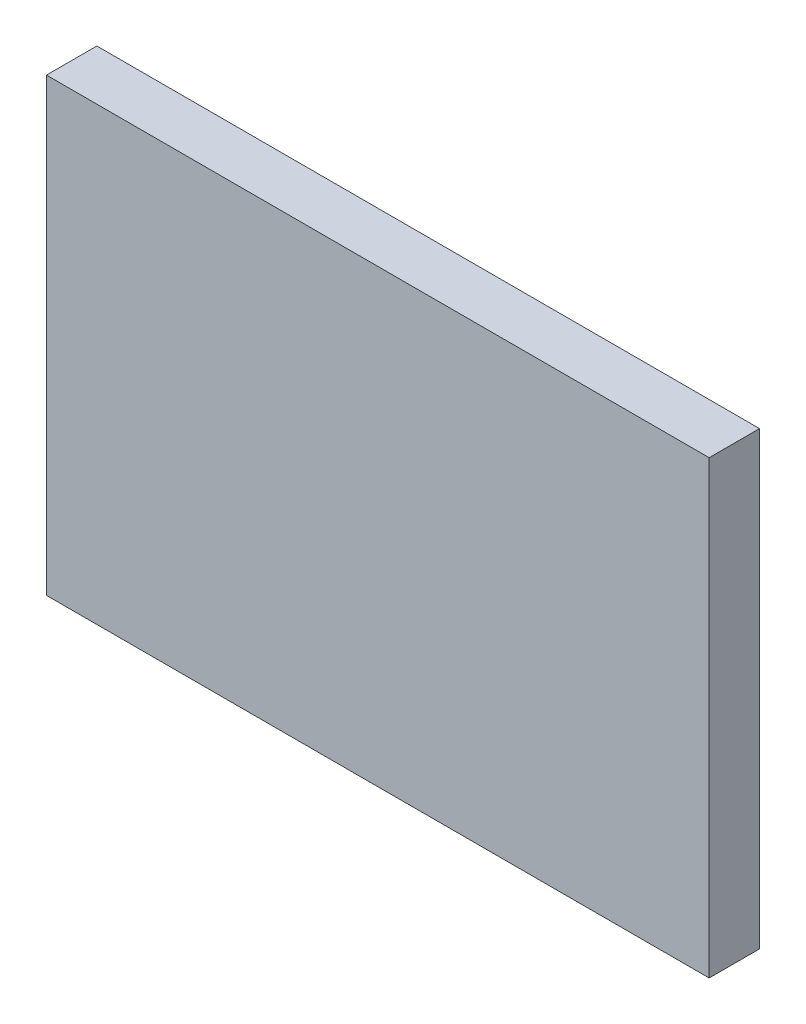
ISO-10303-21;
HEADER;
FILE_DESCRIPTION(('STEP AP214'),'2;1');
FILE_NAME('part.step','',(''),(''),'','','');
FILE_SCHEMA(('AUTOMOTIVE_DESIGN { 1 0 10303 214 1 1 1 1 }'));
ENDSEC;
DATA;
#1=APPLICATION_CONTEXT('core data for automotive mechanical design processes');
#2=APPLICATION_PROTOCOL_DEFINITION('international standard','automotive_design',2000,#1);
#3=PRODUCT_CONTEXT('',#1,'mechanical');
#4=PRODUCT('Part','Part','',(#3));
#5=PRODUCT_RELATED_PRODUCT_CATEGORY('part','',(#4));
#6=PRODUCT_DEFINITION_FORMATION('','',#4);
#7=PRODUCT_DEFINITION_CONTEXT('part definition',#1,'design');
#8=PRODUCT_DEFINITION('design','',#6,#7);
#9=PRODUCT_DEFINITION_SHAPE('','',#8);
#10=(LENGTH_UNIT() NAMED_UNIT(*) SI_UNIT(.MILLI.,.METRE.));
#11=(NAMED_UNIT(*) PLANE_ANGLE_UNIT() SI_UNIT($,.RADIAN.));
#12=(NAMED_UNIT(*) SI_UNIT($,.STERADIAN.) SOLID_ANGLE_UNIT());
#13=UNCERTAINTY_MEASURE_WITH_UNIT(LENGTH_MEASURE(1.E-05),#10,'distance_accuracy_value','');
#14=(GEOMETRIC_REPRESENTATION_CONTEXT(3) GLOBAL_UNCERTAINTY_ASSIGNED_CONTEXT((#13)) GLOBAL_UNIT_ASSIGNED_CONTEXT((#10,
#11,#12)) REPRESENTATION_CONTEXT('',''));
#15=CARTESIAN_POINT('',(0.,0.,0.));
#16=DIRECTION('',(0.,0.,1.));
#17=DIRECTION('',(1.,0.,0.));
#18=AXIS2_PLACEMENT_3D('',#15,#16,#17);
#19=CARTESIAN_POINT('',(0.,0.,3.8));
#20=DIRECTION('',(1.,0.,0.));
#21=DIRECTION('',(0.,1.,0.));
#22=AXIS2_PLACEMENT_3D('',#19,#20,#21);
#23=PLANE('',#22);
#24=DIRECTION('',(0.,-1.,0.));
#25=VECTOR('',#24,1.);
#26=CARTESIAN_POINT('',(0.,0.,0.));
#27=LINE('',#26,#25);
#28=CARTESIAN_POINT('',(0.,0.,0.));
#29=VERTEX_POINT('',#28);
#30=CARTESIAN_POINT('',(0.,-34.,0.));
#31=VERTEX_POINT('',#30);
#32=EDGE_CURVE('E81',#29,#31,#27,.T.);
#33=ORIENTED_EDGE('',*,*,#32,.T.);
#34=DIRECTION('',(0.,0.,-1.));
#35=VECTOR('',#34,1.);
#36=CARTESIAN_POINT('',(0.,-34.,3.8));
#37=LINE('',#36,#35);
#38=CARTESIAN_POINT('',(0.,-34.,3.8));
#39=VERTEX_POINT('',#38);
#40=EDGE_CURVE('E11',#39,#31,#37,.T.);
#41=ORIENTED_EDGE('',*,*,#40,.F.);
#42=DIRECTION('',(0.,-1.,0.));
#43=VECTOR('',#42,1.);
#44=CARTESIAN_POINT('',(0.,0.,3.8));
#45=LINE('',#44,#43);
#46=CARTESIAN_POINT('',(0.,0.,3.8));
#47=VERTEX_POINT('',#46);
#48=EDGE_CURVE('E83',#47,#39,#45,.T.);
#49=ORIENTED_EDGE('',*,*,#48,.F.);
#50=DIRECTION('',(0.,0.,-1.));
#51=VECTOR('',#50,1.);
#52=CARTESIAN_POINT('',(0.,0.,3.8));
#53=LINE('',#52,#51);
#54=EDGE_CURVE('E44',#47,#29,#53,.T.);
#55=ORIENTED_EDGE('',*,*,#54,.T.);
#56=EDGE_LOOP('',(#33,#41,#49,#55));
#57=FACE_BOUND('',#56,.T.);
#58=ADVANCED_FACE('F36',(#57),#23,.F.);
#59=CARTESIAN_POINT('',(0.,-34.,3.8));
#60=DIRECTION('',(0.,1.,0.));
#61=DIRECTION('',(0.,0.,1.));
#62=AXIS2_PLACEMENT_3D('',#59,#60,#61);
#63=PLANE('',#62);
#64=DIRECTION('',(1.,0.,0.));
#65=VECTOR('',#64,1.);
#66=CARTESIAN_POINT('',(0.,-34.,0.));
#67=LINE('',#66,#65);
#68=CARTESIAN_POINT('',(50.,-34.,0.));
#69=VERTEX_POINT('',#68);
#70=EDGE_CURVE('E64',#31,#69,#67,.T.);
#71=ORIENTED_EDGE('',*,*,#70,.T.);
#72=DIRECTION('',(0.,0.,-1.));
#73=VECTOR('',#72,1.);
#74=CARTESIAN_POINT('',(50.,-34.,3.8));
#75=LINE('',#74,#73);
#76=CARTESIAN_POINT('',(50.,-34.,3.8));
#77=VERTEX_POINT('',#76);
#78=EDGE_CURVE('E92',#77,#69,#75,.T.);
#79=ORIENTED_EDGE('',*,*,#78,.F.);
#80=DIRECTION('',(1.,0.,0.));
#81=VECTOR('',#80,1.);
#82=CARTESIAN_POINT('',(0.,-34.,3.8));
#83=LINE('',#82,#81);
#84=EDGE_CURVE('E101',#39,#77,#83,.T.);
#85=ORIENTED_EDGE('',*,*,#84,.F.);
#86=ORIENTED_EDGE('',*,*,#40,.T.);
#87=EDGE_LOOP('',(#71,#79,#85,#86));
#88=FACE_BOUND('',#87,.T.);
#89=ADVANCED_FACE('F110',(#88),#63,.F.);
#90=CARTESIAN_POINT('',(0.,0.,3.8));
#91=DIRECTION('',(0.,-1.,0.));
#92=DIRECTION('',(0.,0.,-1.));
#93=AXIS2_PLACEMENT_3D('',#90,#91,#92);
#94=PLANE('',#93);
#95=DIRECTION('',(-1.,0.,0.));
#96=VECTOR('',#95,1.);
#97=CARTESIAN_POINT('',(0.,0.,0.));
#98=LINE('',#97,#96);
#99=CARTESIAN_POINT('',(50.,0.,0.));
#100=VERTEX_POINT('',#99);
#101=EDGE_CURVE('E76',#100,#29,#98,.T.);
#102=ORIENTED_EDGE('',*,*,#101,.T.);
#103=ORIENTED_EDGE('',*,*,#54,.F.);
#104=DIRECTION('',(-1.,0.,0.));
#105=VECTOR('',#104,1.);
#106=CARTESIAN_POINT('',(0.,0.,3.8));
#107=LINE('',#106,#105);
#108=CARTESIAN_POINT('',(50.,0.,3.8));
#109=VERTEX_POINT('',#108);
#110=EDGE_CURVE('E52',#109,#47,#107,.T.);
#111=ORIENTED_EDGE('',*,*,#110,.F.);
#112=DIRECTION('',(0.,0.,-1.));
#113=VECTOR('',#112,1.);
#114=CARTESIAN_POINT('',(50.,0.,3.8));
#115=LINE('',#114,#113);
#116=EDGE_CURVE('E90',#109,#100,#115,.T.);
#117=ORIENTED_EDGE('',*,*,#116,.T.);
#118=EDGE_LOOP('',(#102,#103,#111,#117));
#119=FACE_BOUND('',#118,.T.);
#120=ADVANCED_FACE('F95',(#119),#94,.F.);
#121=CARTESIAN_POINT('',(0.,0.,3.8));
#122=DIRECTION('',(0.,0.,1.));
#123=DIRECTION('',(1.,0.,0.));
#124=AXIS2_PLACEMENT_3D('',#121,#122,#123);
#125=PLANE('',#124);
#126=ORIENTED_EDGE('',*,*,#48,.T.);
#127=ORIENTED_EDGE('',*,*,#84,.T.);
#128=DIRECTION('',(0.,1.,0.));
#129=VECTOR('',#128,1.);
#130=CARTESIAN_POINT('',(50.,-34.,3.8));
#131=LINE('',#130,#129);
#132=EDGE_CURVE('E93',#77,#109,#131,.T.);
#133=ORIENTED_EDGE('',*,*,#132,.T.);
#134=ORIENTED_EDGE('',*,*,#110,.T.);
#135=EDGE_LOOP('',(#126,#127,#133,#134));
#136=FACE_BOUND('',#135,.T.);
#137=ADVANCED_FACE('F108',(#136),#125,.T.);
#138=CARTESIAN_POINT('',(0.,0.,0.));
#139=DIRECTION('',(0.,0.,1.));
#140=DIRECTION('',(1.,0.,0.));
#141=AXIS2_PLACEMENT_3D('',#138,#139,#140);
#142=PLANE('',#141);
#143=ORIENTED_EDGE('',*,*,#32,.F.);
#144=ORIENTED_EDGE('',*,*,#101,.F.);
#145=DIRECTION('',(0.,1.,0.));
#146=VECTOR('',#145,1.);
#147=CARTESIAN_POINT('',(50.,-34.,0.));
#148=LINE('',#147,#146);
#149=EDGE_CURVE('E79',#69,#100,#148,.T.);
#150=ORIENTED_EDGE('',*,*,#149,.F.);
#151=ORIENTED_EDGE('',*,*,#70,.F.);
#152=EDGE_LOOP('',(#143,#144,#150,#151));
#153=FACE_BOUND('',#152,.T.);
#154=ADVANCED_FACE('F78',(#153),#142,.F.);
#155=CARTESIAN_POINT('',(50.,-34.,3.8));
#156=DIRECTION('',(-1.,0.,0.));
#157=DIRECTION('',(0.,0.,1.));
#158=AXIS2_PLACEMENT_3D('',#155,#156,#157);
#159=PLANE('',#158);
#160=ORIENTED_EDGE('',*,*,#149,.T.);
#161=ORIENTED_EDGE('',*,*,#116,.F.);
#162=ORIENTED_EDGE('',*,*,#132,.F.);
#163=ORIENTED_EDGE('',*,*,#78,.T.);
#164=EDGE_LOOP('',(#160,#161,#162,#163));
#165=FACE_BOUND('',#164,.T.);
#166=ADVANCED_FACE('F88',(#165),#159,.F.);
#167=CLOSED_SHELL('',(#58,#89,#120,#137,#154,#166));
#168=MANIFOLD_SOLID_BREP('B2',#167);
#169=ADVANCED_BREP_SHAPE_REPRESENTATION('',(#18,#168),#14);
#170=SHAPE_DEFINITION_REPRESENTATION(#9,#169);
ENDSEC;
END-ISO-10303-21;
